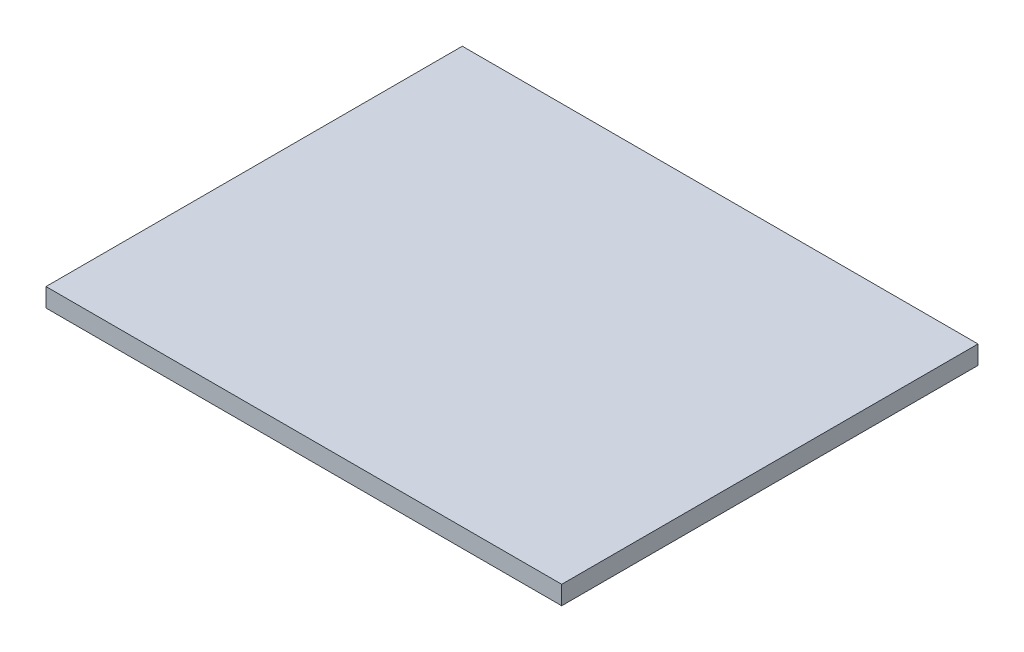
ISO-10303-21;
HEADER;
FILE_DESCRIPTION(('STEP AP214'),'2;1');
FILE_NAME('part.step','',(''),(''),'','','');
FILE_SCHEMA(('AUTOMOTIVE_DESIGN { 1 0 10303 214 1 1 1 1 }'));
ENDSEC;
DATA;
#1=APPLICATION_CONTEXT('core data for automotive mechanical design processes');
#2=APPLICATION_PROTOCOL_DEFINITION('international standard','automotive_design',2000,#1);
#3=PRODUCT_CONTEXT('',#1,'mechanical');
#4=PRODUCT('Part','Part','',(#3));
#5=PRODUCT_RELATED_PRODUCT_CATEGORY('part','',(#4));
#6=PRODUCT_DEFINITION_FORMATION('','',#4);
#7=PRODUCT_DEFINITION_CONTEXT('part definition',#1,'design');
#8=PRODUCT_DEFINITION('design','',#6,#7);
#9=PRODUCT_DEFINITION_SHAPE('','',#8);
#10=(LENGTH_UNIT() NAMED_UNIT(*) SI_UNIT(.MILLI.,.METRE.));
#11=(NAMED_UNIT(*) PLANE_ANGLE_UNIT() SI_UNIT($,.RADIAN.));
#12=(NAMED_UNIT(*) SI_UNIT($,.STERADIAN.) SOLID_ANGLE_UNIT());
#13=UNCERTAINTY_MEASURE_WITH_UNIT(LENGTH_MEASURE(1.E-05),#10,'distance_accuracy_value','');
#14=(GEOMETRIC_REPRESENTATION_CONTEXT(3) GLOBAL_UNCERTAINTY_ASSIGNED_CONTEXT((#13)) GLOBAL_UNIT_ASSIGNED_CONTEXT((#10,
#11,#12)) REPRESENTATION_CONTEXT('',''));
#15=CARTESIAN_POINT('',(0.,0.,0.));
#16=DIRECTION('',(0.,0.,1.));
#17=DIRECTION('',(1.,0.,0.));
#18=AXIS2_PLACEMENT_3D('',#15,#16,#17);
#19=CARTESIAN_POINT('',(0.,3.,0.));
#20=DIRECTION('',(1.,0.,0.));
#21=DIRECTION('',(0.,0.,-1.));
#22=AXIS2_PLACEMENT_3D('',#19,#20,#21);
#23=PLANE('',#22);
#24=DIRECTION('',(0.,0.,1.));
#25=VECTOR('',#24,1.);
#26=CARTESIAN_POINT('',(0.,0.,0.));
#27=LINE('',#26,#25);
#28=CARTESIAN_POINT('',(0.,0.,-67.));
#29=VERTEX_POINT('',#28);
#30=CARTESIAN_POINT('',(0.,0.,0.));
#31=VERTEX_POINT('',#30);
#32=EDGE_CURVE('E113',#29,#31,#27,.T.);
#33=ORIENTED_EDGE('',*,*,#32,.T.);
#34=DIRECTION('',(0.,-1.,0.));
#35=VECTOR('',#34,1.);
#36=CARTESIAN_POINT('',(0.,3.,0.));
#37=LINE('',#36,#35);
#38=CARTESIAN_POINT('',(0.,3.,0.));
#39=VERTEX_POINT('',#38);
#40=EDGE_CURVE('E11',#39,#31,#37,.T.);
#41=ORIENTED_EDGE('',*,*,#40,.F.);
#42=DIRECTION('',(0.,0.,1.));
#43=VECTOR('',#42,1.);
#44=CARTESIAN_POINT('',(0.,3.,0.));
#45=LINE('',#44,#43);
#46=CARTESIAN_POINT('',(0.,3.,-67.));
#47=VERTEX_POINT('',#46);
#48=EDGE_CURVE('E97',#47,#39,#45,.T.);
#49=ORIENTED_EDGE('',*,*,#48,.F.);
#50=DIRECTION('',(0.,-1.,0.));
#51=VECTOR('',#50,1.);
#52=CARTESIAN_POINT('',(0.,3.,-67.));
#53=LINE('',#52,#51);
#54=EDGE_CURVE('E109',#47,#29,#53,.T.);
#55=ORIENTED_EDGE('',*,*,#54,.T.);
#56=EDGE_LOOP('',(#33,#41,#49,#55));
#57=FACE_BOUND('',#56,.T.);
#58=ADVANCED_FACE('F45',(#57),#23,.F.);
#59=CARTESIAN_POINT('',(0.,3.,0.));
#60=DIRECTION('',(0.,0.,-1.));
#61=DIRECTION('',(-1.,0.,0.));
#62=AXIS2_PLACEMENT_3D('',#59,#60,#61);
#63=PLANE('',#62);
#64=DIRECTION('',(1.,0.,0.));
#65=VECTOR('',#64,1.);
#66=CARTESIAN_POINT('',(0.,0.,0.));
#67=LINE('',#66,#65);
#68=CARTESIAN_POINT('',(83.,0.,0.));
#69=VERTEX_POINT('',#68);
#70=EDGE_CURVE('E102',#31,#69,#67,.T.);
#71=ORIENTED_EDGE('',*,*,#70,.T.);
#72=DIRECTION('',(0.,-1.,0.));
#73=VECTOR('',#72,1.);
#74=CARTESIAN_POINT('',(83.,3.,0.));
#75=LINE('',#74,#73);
#76=CARTESIAN_POINT('',(83.,3.,0.));
#77=VERTEX_POINT('',#76);
#78=EDGE_CURVE('E54',#77,#69,#75,.T.);
#79=ORIENTED_EDGE('',*,*,#78,.F.);
#80=DIRECTION('',(1.,0.,0.));
#81=VECTOR('',#80,1.);
#82=CARTESIAN_POINT('',(0.,3.,0.));
#83=LINE('',#82,#81);
#84=EDGE_CURVE('E92',#39,#77,#83,.T.);
#85=ORIENTED_EDGE('',*,*,#84,.F.);
#86=ORIENTED_EDGE('',*,*,#40,.T.);
#87=EDGE_LOOP('',(#71,#79,#85,#86));
#88=FACE_BOUND('',#87,.T.);
#89=ADVANCED_FACE('F101',(#88),#63,.F.);
#90=CARTESIAN_POINT('',(83.,3.,0.));
#91=DIRECTION('',(-1.,0.,0.));
#92=DIRECTION('',(0.,0.,1.));
#93=AXIS2_PLACEMENT_3D('',#90,#91,#92);
#94=PLANE('',#93);
#95=DIRECTION('',(0.,0.,-1.));
#96=VECTOR('',#95,1.);
#97=CARTESIAN_POINT('',(83.,0.,0.));
#98=LINE('',#97,#96);
#99=CARTESIAN_POINT('',(83.,0.,-67.));
#100=VERTEX_POINT('',#99);
#101=EDGE_CURVE('E79',#69,#100,#98,.T.);
#102=ORIENTED_EDGE('',*,*,#101,.T.);
#103=DIRECTION('',(0.,-1.,0.));
#104=VECTOR('',#103,1.);
#105=CARTESIAN_POINT('',(83.,3.,-67.));
#106=LINE('',#105,#104);
#107=CARTESIAN_POINT('',(83.,3.,-67.));
#108=VERTEX_POINT('',#107);
#109=EDGE_CURVE('E104',#108,#100,#106,.T.);
#110=ORIENTED_EDGE('',*,*,#109,.F.);
#111=DIRECTION('',(0.,0.,-1.));
#112=VECTOR('',#111,1.);
#113=CARTESIAN_POINT('',(83.,3.,0.));
#114=LINE('',#113,#112);
#115=EDGE_CURVE('E95',#77,#108,#114,.T.);
#116=ORIENTED_EDGE('',*,*,#115,.F.);
#117=ORIENTED_EDGE('',*,*,#78,.T.);
#118=EDGE_LOOP('',(#102,#110,#116,#117));
#119=FACE_BOUND('',#118,.T.);
#120=ADVANCED_FACE('F105',(#119),#94,.F.);
#121=CARTESIAN_POINT('',(0.,3.,-67.));
#122=DIRECTION('',(0.,0.,1.));
#123=DIRECTION('',(1.,0.,0.));
#124=AXIS2_PLACEMENT_3D('',#121,#122,#123);
#125=PLANE('',#124);
#126=DIRECTION('',(-1.,0.,0.));
#127=VECTOR('',#126,1.);
#128=CARTESIAN_POINT('',(0.,0.,-67.));
#129=LINE('',#128,#127);
#130=EDGE_CURVE('E85',#100,#29,#129,.T.);
#131=ORIENTED_EDGE('',*,*,#130,.T.);
#132=ORIENTED_EDGE('',*,*,#54,.F.);
#133=DIRECTION('',(-1.,0.,0.));
#134=VECTOR('',#133,1.);
#135=CARTESIAN_POINT('',(0.,3.,-67.));
#136=LINE('',#135,#134);
#137=EDGE_CURVE('E62',#108,#47,#136,.T.);
#138=ORIENTED_EDGE('',*,*,#137,.F.);
#139=ORIENTED_EDGE('',*,*,#109,.T.);
#140=EDGE_LOOP('',(#131,#132,#138,#139));
#141=FACE_BOUND('',#140,.T.);
#142=ADVANCED_FACE('F126',(#141),#125,.F.);
#143=CARTESIAN_POINT('',(0.,3.,0.));
#144=DIRECTION('',(0.,-1.,0.));
#145=DIRECTION('',(0.,0.,-1.));
#146=AXIS2_PLACEMENT_3D('',#143,#144,#145);
#147=PLANE('',#146);
#148=ORIENTED_EDGE('',*,*,#48,.T.);
#149=ORIENTED_EDGE('',*,*,#84,.T.);
#150=ORIENTED_EDGE('',*,*,#115,.T.);
#151=ORIENTED_EDGE('',*,*,#137,.T.);
#152=EDGE_LOOP('',(#148,#149,#150,#151));
#153=FACE_BOUND('',#152,.T.);
#154=ADVANCED_FACE('F93',(#153),#147,.F.);
#155=CARTESIAN_POINT('',(0.,0.,0.));
#156=DIRECTION('',(0.,-1.,0.));
#157=DIRECTION('',(0.,0.,-1.));
#158=AXIS2_PLACEMENT_3D('',#155,#156,#157);
#159=PLANE('',#158);
#160=ORIENTED_EDGE('',*,*,#32,.F.);
#161=ORIENTED_EDGE('',*,*,#130,.F.);
#162=ORIENTED_EDGE('',*,*,#101,.F.);
#163=ORIENTED_EDGE('',*,*,#70,.F.);
#164=EDGE_LOOP('',(#160,#161,#162,#163));
#165=FACE_BOUND('',#164,.T.);
#166=ADVANCED_FACE('F129',(#165),#159,.T.);
#167=CLOSED_SHELL('',(#58,#89,#120,#142,#154,#166));
#168=MANIFOLD_SOLID_BREP('B2',#167);
#169=ADVANCED_BREP_SHAPE_REPRESENTATION('',(#18,#168),#14);
#170=SHAPE_DEFINITION_REPRESENTATION(#9,#169);
ENDSEC;
END-ISO-10303-21;
